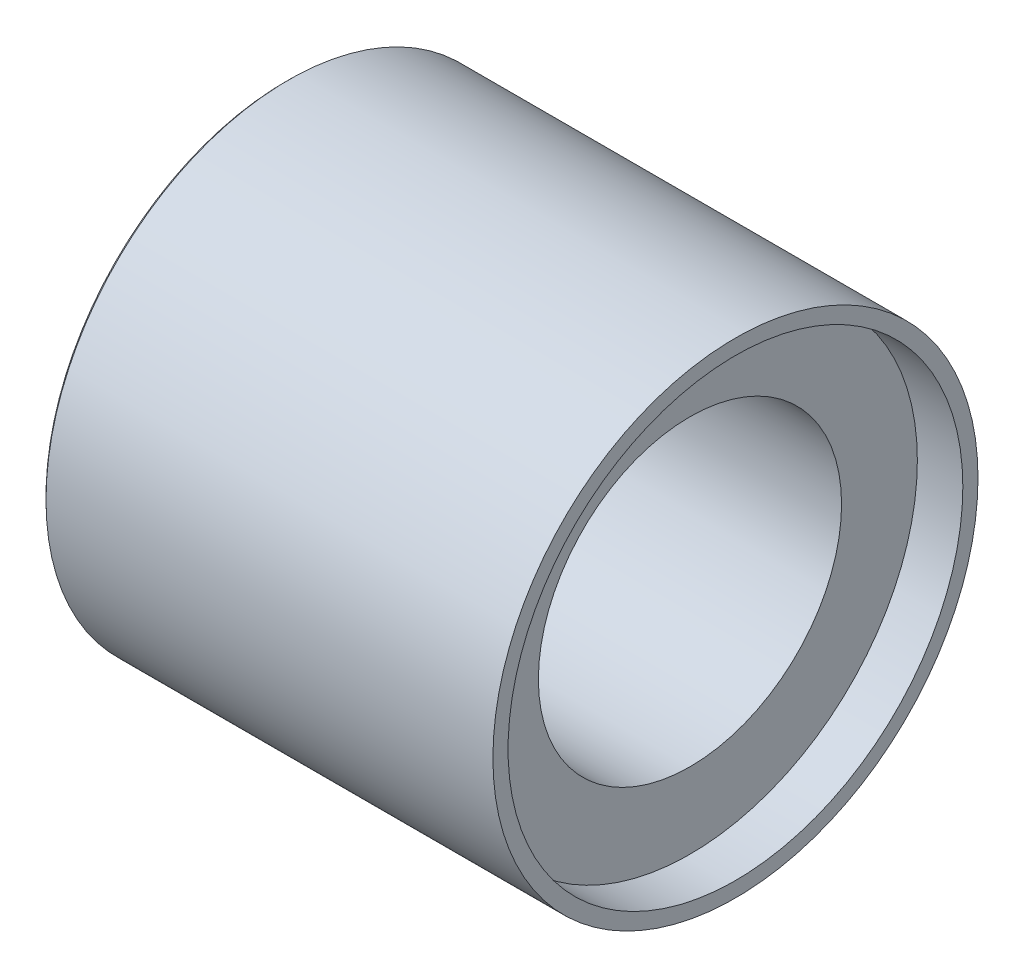
ISO-10303-21;
HEADER;
FILE_DESCRIPTION(('STEP AP214'),'2;1');
FILE_NAME('part.step','',(''),(''),'','','');
FILE_SCHEMA(('AUTOMOTIVE_DESIGN { 1 0 10303 214 1 1 1 1 }'));
ENDSEC;
DATA;
#1=APPLICATION_CONTEXT('core data for automotive mechanical design processes');
#2=APPLICATION_PROTOCOL_DEFINITION('international standard','automotive_design',2000,#1);
#3=PRODUCT_CONTEXT('',#1,'mechanical');
#4=PRODUCT('Part','Part','',(#3));
#5=PRODUCT_RELATED_PRODUCT_CATEGORY('part','',(#4));
#6=PRODUCT_DEFINITION_FORMATION('','',#4);
#7=PRODUCT_DEFINITION_CONTEXT('part definition',#1,'design');
#8=PRODUCT_DEFINITION('design','',#6,#7);
#9=PRODUCT_DEFINITION_SHAPE('','',#8);
#10=(LENGTH_UNIT() NAMED_UNIT(*) SI_UNIT(.MILLI.,.METRE.));
#11=(NAMED_UNIT(*) PLANE_ANGLE_UNIT() SI_UNIT($,.RADIAN.));
#12=(NAMED_UNIT(*) SI_UNIT($,.STERADIAN.) SOLID_ANGLE_UNIT());
#13=UNCERTAINTY_MEASURE_WITH_UNIT(LENGTH_MEASURE(1.E-05),#10,'distance_accuracy_value','');
#14=(GEOMETRIC_REPRESENTATION_CONTEXT(3) GLOBAL_UNCERTAINTY_ASSIGNED_CONTEXT((#13)) GLOBAL_UNIT_ASSIGNED_CONTEXT((#10,
#11,#12)) REPRESENTATION_CONTEXT('',''));
#15=CARTESIAN_POINT('',(0.,0.,0.));
#16=DIRECTION('',(0.,0.,1.));
#17=DIRECTION('',(1.,0.,0.));
#18=AXIS2_PLACEMENT_3D('',#15,#16,#17);
#19=CARTESIAN_POINT('',(30.34,0.,6.5));
#20=DIRECTION('',(1.,0.,0.));
#21=DIRECTION('',(0.,0.,-1.));
#22=AXIS2_PLACEMENT_3D('',#19,#20,#21);
#23=PLANE('',#22);
#24=CARTESIAN_POINT('',(30.34,0.,0.));
#25=DIRECTION('',(-1.,0.,0.));
#26=DIRECTION('',(0.,0.,1.));
#27=AXIS2_PLACEMENT_3D('',#24,#25,#26);
#28=CIRCLE('',#27,5.);
#29=CARTESIAN_POINT('',(30.34,0.,5.));
#30=VERTEX_POINT('',#29);
#31=EDGE_CURVE('E18',#30,#30,#28,.T.);
#32=ORIENTED_EDGE('',*,*,#31,.T.);
#33=EDGE_LOOP('',(#32));
#34=FACE_BOUND('',#33,.T.);
#35=CARTESIAN_POINT('',(30.34,0.,0.));
#36=DIRECTION('',(1.,0.,0.));
#37=DIRECTION('',(0.,0.,-1.));
#38=AXIS2_PLACEMENT_3D('',#35,#36,#37);
#39=CIRCLE('',#38,7.5);
#40=CARTESIAN_POINT('',(30.34,0.,-7.5));
#41=VERTEX_POINT('',#40);
#42=EDGE_CURVE('E37',#41,#41,#39,.T.);
#43=ORIENTED_EDGE('',*,*,#42,.T.);
#44=EDGE_LOOP('',(#43));
#45=FACE_BOUND('',#44,.T.);
#46=ADVANCED_FACE('F15',(#34,#45),#23,.T.);
#47=CARTESIAN_POINT('',(23.67,0.,0.));
#48=DIRECTION('',(-1.,0.,0.));
#49=DIRECTION('',(0.,0.,1.));
#50=AXIS2_PLACEMENT_3D('',#47,#48,#49);
#51=CYLINDRICAL_SURFACE('',#50,5.);
#52=ORIENTED_EDGE('',*,*,#31,.F.);
#53=EDGE_LOOP('',(#52));
#54=FACE_BOUND('',#53,.T.);
#55=CARTESIAN_POINT('',(17.,0.,0.));
#56=DIRECTION('',(-1.,0.,0.));
#57=DIRECTION('',(0.,0.,1.));
#58=AXIS2_PLACEMENT_3D('',#55,#56,#57);
#59=CIRCLE('',#58,5.);
#60=CARTESIAN_POINT('',(17.,0.,5.));
#61=VERTEX_POINT('',#60);
#62=EDGE_CURVE('E35',#61,#61,#59,.F.);
#63=ORIENTED_EDGE('',*,*,#62,.F.);
#64=EDGE_LOOP('',(#63));
#65=FACE_BOUND('',#64,.T.);
#66=ADVANCED_FACE('F45',(#54,#65),#51,.F.);
#67=CARTESIAN_POINT('',(31.09,0.,0.));
#68=DIRECTION('',(1.,0.,0.));
#69=DIRECTION('',(0.,0.,-1.));
#70=AXIS2_PLACEMENT_3D('',#67,#68,#69);
#71=CYLINDRICAL_SURFACE('',#70,7.5);
#72=ORIENTED_EDGE('',*,*,#42,.F.);
#73=EDGE_LOOP('',(#72));
#74=FACE_BOUND('',#73,.T.);
#75=CARTESIAN_POINT('',(31.84,0.,0.));
#76=DIRECTION('',(1.,0.,0.));
#77=DIRECTION('',(0.,0.,-1.));
#78=AXIS2_PLACEMENT_3D('',#75,#76,#77);
#79=CIRCLE('',#78,7.5);
#80=CARTESIAN_POINT('',(31.84,0.,-7.5));
#81=VERTEX_POINT('',#80);
#82=EDGE_CURVE('E32',#81,#81,#79,.F.);
#83=ORIENTED_EDGE('',*,*,#82,.F.);
#84=EDGE_LOOP('',(#83));
#85=FACE_BOUND('',#84,.T.);
#86=ADVANCED_FACE('F48',(#74,#85),#71,.F.);
#87=CARTESIAN_POINT('',(17.,0.,6.5));
#88=DIRECTION('',(-1.,0.,0.));
#89=DIRECTION('',(0.,0.,1.));
#90=AXIS2_PLACEMENT_3D('',#87,#88,#89);
#91=PLANE('',#90);
#92=ORIENTED_EDGE('',*,*,#62,.T.);
#93=EDGE_LOOP('',(#92));
#94=FACE_BOUND('',#93,.T.);
#95=CARTESIAN_POINT('',(17.,0.,0.));
#96=DIRECTION('',(1.,0.,0.));
#97=DIRECTION('',(0.,0.,-1.));
#98=AXIS2_PLACEMENT_3D('',#95,#96,#97);
#99=CIRCLE('',#98,7.9);
#100=CARTESIAN_POINT('',(17.,0.,-7.9));
#101=VERTEX_POINT('',#100);
#102=EDGE_CURVE('E27',#101,#101,#99,.T.);
#103=ORIENTED_EDGE('',*,*,#102,.F.);
#104=EDGE_LOOP('',(#103));
#105=FACE_BOUND('',#104,.T.);
#106=ADVANCED_FACE('F51',(#94,#105),#91,.T.);
#107=CARTESIAN_POINT('',(31.84,0.,7.75));
#108=DIRECTION('',(1.,0.,0.));
#109=DIRECTION('',(0.,0.,-1.));
#110=AXIS2_PLACEMENT_3D('',#107,#108,#109);
#111=PLANE('',#110);
#112=CARTESIAN_POINT('',(31.84,0.,0.));
#113=DIRECTION('',(-1.,0.,0.));
#114=DIRECTION('',(0.,0.,1.));
#115=AXIS2_PLACEMENT_3D('',#112,#113,#114);
#116=CIRCLE('',#115,8.);
#117=CARTESIAN_POINT('',(31.84,0.,8.));
#118=VERTEX_POINT('',#117);
#119=EDGE_CURVE('E22',#118,#118,#116,.T.);
#120=ORIENTED_EDGE('',*,*,#119,.F.);
#121=EDGE_LOOP('',(#120));
#122=FACE_BOUND('',#121,.T.);
#123=ORIENTED_EDGE('',*,*,#82,.T.);
#124=EDGE_LOOP('',(#123));
#125=FACE_BOUND('',#124,.T.);
#126=ADVANCED_FACE('F54',(#122,#125),#111,.T.);
#127=CARTESIAN_POINT('',(17.1,0.,0.));
#128=DIRECTION('',(1.,0.,0.));
#129=DIRECTION('',(0.,0.,-1.));
#130=AXIS2_PLACEMENT_3D('',#127,#128,#129);
#131=CONICAL_SURFACE('',#130,8.,0.785398163397448);
#132=ORIENTED_EDGE('',*,*,#102,.T.);
#133=EDGE_LOOP('',(#132));
#134=FACE_BOUND('',#133,.T.);
#135=CARTESIAN_POINT('',(17.1,0.,0.));
#136=DIRECTION('',(-1.,0.,0.));
#137=DIRECTION('',(0.,0.,1.));
#138=AXIS2_PLACEMENT_3D('',#135,#136,#137);
#139=CIRCLE('',#138,8.);
#140=CARTESIAN_POINT('',(17.1,0.,8.));
#141=VERTEX_POINT('',#140);
#142=EDGE_CURVE('E10',#141,#141,#139,.F.);
#143=ORIENTED_EDGE('',*,*,#142,.F.);
#144=EDGE_LOOP('',(#143));
#145=FACE_BOUND('',#144,.T.);
#146=ADVANCED_FACE('F58',(#134,#145),#131,.T.);
#147=CARTESIAN_POINT('',(23.67,0.,0.));
#148=DIRECTION('',(-1.,0.,0.));
#149=DIRECTION('',(0.,0.,1.));
#150=AXIS2_PLACEMENT_3D('',#147,#148,#149);
#151=CYLINDRICAL_SURFACE('',#150,8.);
#152=ORIENTED_EDGE('',*,*,#119,.T.);
#153=EDGE_LOOP('',(#152));
#154=FACE_BOUND('',#153,.T.);
#155=ORIENTED_EDGE('',*,*,#142,.T.);
#156=EDGE_LOOP('',(#155));
#157=FACE_BOUND('',#156,.T.);
#158=ADVANCED_FACE('F61',(#154,#157),#151,.T.);
#159=CLOSED_SHELL('',(#46,#66,#86,#106,#126,#146,#158));
#160=MANIFOLD_SOLID_BREP('B1',#159);
#161=ADVANCED_BREP_SHAPE_REPRESENTATION('',(#18,#160),#14);
#162=SHAPE_DEFINITION_REPRESENTATION(#9,#161);
ENDSEC;
END-ISO-10303-21;
